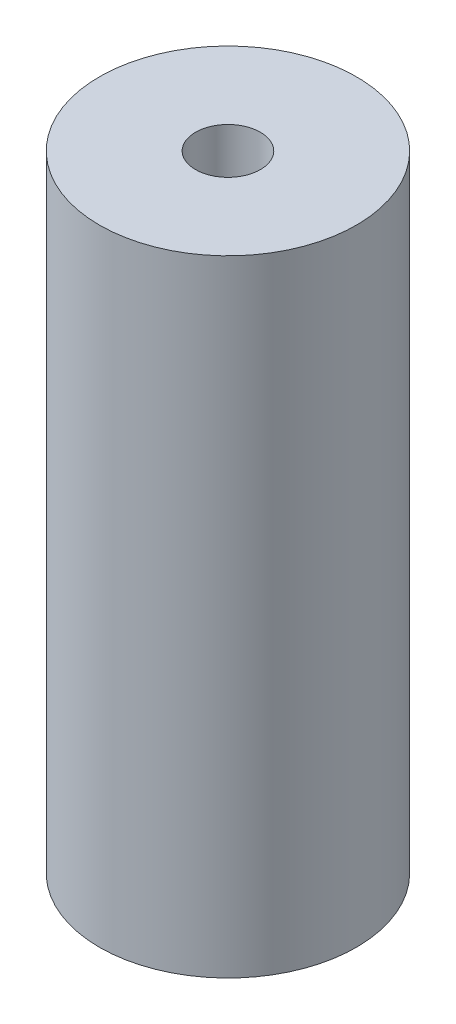
ISO-10303-21;
HEADER;
FILE_DESCRIPTION(('STEP AP214'),'2;1');
FILE_NAME('part.step','',(''),(''),'','','');
FILE_SCHEMA(('AUTOMOTIVE_DESIGN { 1 0 10303 214 1 1 1 1 }'));
ENDSEC;
DATA;
#1=APPLICATION_CONTEXT('core data for automotive mechanical design processes');
#2=APPLICATION_PROTOCOL_DEFINITION('international standard','automotive_design',2000,#1);
#3=PRODUCT_CONTEXT('',#1,'mechanical');
#4=PRODUCT('Part','Part','',(#3));
#5=PRODUCT_RELATED_PRODUCT_CATEGORY('part','',(#4));
#6=PRODUCT_DEFINITION_FORMATION('','',#4);
#7=PRODUCT_DEFINITION_CONTEXT('part definition',#1,'design');
#8=PRODUCT_DEFINITION('design','',#6,#7);
#9=PRODUCT_DEFINITION_SHAPE('','',#8);
#10=(LENGTH_UNIT() NAMED_UNIT(*) SI_UNIT(.MILLI.,.METRE.));
#11=(NAMED_UNIT(*) PLANE_ANGLE_UNIT() SI_UNIT($,.RADIAN.));
#12=(NAMED_UNIT(*) SI_UNIT($,.STERADIAN.) SOLID_ANGLE_UNIT());
#13=UNCERTAINTY_MEASURE_WITH_UNIT(LENGTH_MEASURE(1.E-05),#10,'distance_accuracy_value','');
#14=(GEOMETRIC_REPRESENTATION_CONTEXT(3) GLOBAL_UNCERTAINTY_ASSIGNED_CONTEXT((#13)) GLOBAL_UNIT_ASSIGNED_CONTEXT((#10,
#11,#12)) REPRESENTATION_CONTEXT('',''));
#15=CARTESIAN_POINT('',(0.,0.,0.));
#16=DIRECTION('',(0.,0.,1.));
#17=DIRECTION('',(1.,0.,0.));
#18=AXIS2_PLACEMENT_3D('',#15,#16,#17);
#19=CARTESIAN_POINT('',(0.,55.,0.));
#20=DIRECTION('',(0.,-1.,0.));
#21=DIRECTION('',(0.,0.,-1.));
#22=AXIS2_PLACEMENT_3D('',#19,#20,#21);
#23=CYLINDRICAL_SURFACE('',#22,11.3);
#24=CARTESIAN_POINT('',(0.,55.,0.));
#25=DIRECTION('',(0.,1.,0.));
#26=DIRECTION('',(0.,0.,1.));
#27=AXIS2_PLACEMENT_3D('',#24,#25,#26);
#28=CIRCLE('',#27,11.3);
#29=CARTESIAN_POINT('',(0.,55.,11.3));
#30=VERTEX_POINT('',#29);
#31=EDGE_CURVE('E10',#30,#30,#28,.T.);
#32=ORIENTED_EDGE('',*,*,#31,.F.);
#33=EDGE_LOOP('',(#32));
#34=FACE_BOUND('',#33,.T.);
#35=CARTESIAN_POINT('',(0.,0.,0.));
#36=DIRECTION('',(0.,1.,0.));
#37=DIRECTION('',(0.,0.,1.));
#38=AXIS2_PLACEMENT_3D('',#35,#36,#37);
#39=CIRCLE('',#38,11.3);
#40=CARTESIAN_POINT('',(0.,0.,11.3));
#41=VERTEX_POINT('',#40);
#42=EDGE_CURVE('E51',#41,#41,#39,.T.);
#43=ORIENTED_EDGE('',*,*,#42,.T.);
#44=EDGE_LOOP('',(#43));
#45=FACE_BOUND('',#44,.T.);
#46=ADVANCED_FACE('F43',(#34,#45),#23,.T.);
#47=CARTESIAN_POINT('',(0.,55.,0.));
#48=DIRECTION('',(0.,1.,0.));
#49=DIRECTION('',(0.,0.,1.));
#50=AXIS2_PLACEMENT_3D('',#47,#48,#49);
#51=PLANE('',#50);
#52=CARTESIAN_POINT('',(0.,55.,0.));
#53=DIRECTION('',(0.,1.,0.));
#54=DIRECTION('',(0.,0.,1.));
#55=AXIS2_PLACEMENT_3D('',#52,#53,#54);
#56=CIRCLE('',#55,2.85);
#57=CARTESIAN_POINT('',(0.,55.,2.85));
#58=VERTEX_POINT('',#57);
#59=EDGE_CURVE('E58',#58,#58,#56,.T.);
#60=ORIENTED_EDGE('',*,*,#59,.F.);
#61=EDGE_LOOP('',(#60));
#62=FACE_BOUND('',#61,.T.);
#63=ORIENTED_EDGE('',*,*,#31,.T.);
#64=EDGE_LOOP('',(#63));
#65=FACE_BOUND('',#64,.T.);
#66=ADVANCED_FACE('F76',(#62,#65),#51,.T.);
#67=CARTESIAN_POINT('',(0.,0.,0.));
#68=DIRECTION('',(0.,1.,0.));
#69=DIRECTION('',(0.,0.,1.));
#70=AXIS2_PLACEMENT_3D('',#67,#68,#69);
#71=PLANE('',#70);
#72=CARTESIAN_POINT('',(0.,0.,0.));
#73=DIRECTION('',(0.,1.,0.));
#74=DIRECTION('',(0.,0.,1.));
#75=AXIS2_PLACEMENT_3D('',#72,#73,#74);
#76=CIRCLE('',#75,2.85);
#77=CARTESIAN_POINT('',(0.,0.,2.85));
#78=VERTEX_POINT('',#77);
#79=EDGE_CURVE('E46',#78,#78,#76,.T.);
#80=ORIENTED_EDGE('',*,*,#79,.T.);
#81=EDGE_LOOP('',(#80));
#82=FACE_BOUND('',#81,.T.);
#83=ORIENTED_EDGE('',*,*,#42,.F.);
#84=EDGE_LOOP('',(#83));
#85=FACE_BOUND('',#84,.T.);
#86=ADVANCED_FACE('F67',(#82,#85),#71,.F.);
#87=CARTESIAN_POINT('',(0.,-55.,0.));
#88=DIRECTION('',(0.,1.,0.));
#89=DIRECTION('',(0.,0.,1.));
#90=AXIS2_PLACEMENT_3D('',#87,#88,#89);
#91=CYLINDRICAL_SURFACE('',#90,2.85);
#92=ORIENTED_EDGE('',*,*,#59,.T.);
#93=EDGE_LOOP('',(#92));
#94=FACE_BOUND('',#93,.T.);
#95=ORIENTED_EDGE('',*,*,#79,.F.);
#96=EDGE_LOOP('',(#95));
#97=FACE_BOUND('',#96,.T.);
#98=ADVANCED_FACE('F70',(#94,#97),#91,.F.);
#99=CLOSED_SHELL('',(#46,#66,#86,#98));
#100=MANIFOLD_SOLID_BREP('B2',#99);
#101=ADVANCED_BREP_SHAPE_REPRESENTATION('',(#18,#100),#14);
#102=SHAPE_DEFINITION_REPRESENTATION(#9,#101);
ENDSEC;
END-ISO-10303-21;
